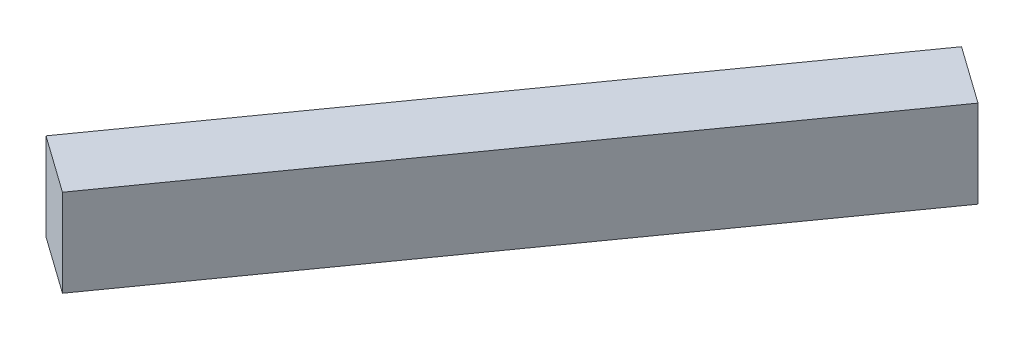
ISO-10303-21;
HEADER;
FILE_DESCRIPTION(('STEP AP214'),'2;1');
FILE_NAME('part.step','',(''),(''),'','','');
FILE_SCHEMA(('AUTOMOTIVE_DESIGN { 1 0 10303 214 1 1 1 1 }'));
ENDSEC;
DATA;
#1=APPLICATION_CONTEXT('core data for automotive mechanical design processes');
#2=APPLICATION_PROTOCOL_DEFINITION('international standard','automotive_design',2000,#1);
#3=PRODUCT_CONTEXT('',#1,'mechanical');
#4=PRODUCT('Part','Part','',(#3));
#5=PRODUCT_RELATED_PRODUCT_CATEGORY('part','',(#4));
#6=PRODUCT_DEFINITION_FORMATION('','',#4);
#7=PRODUCT_DEFINITION_CONTEXT('part definition',#1,'design');
#8=PRODUCT_DEFINITION('design','',#6,#7);
#9=PRODUCT_DEFINITION_SHAPE('','',#8);
#10=(LENGTH_UNIT() NAMED_UNIT(*) SI_UNIT(.MILLI.,.METRE.));
#11=(NAMED_UNIT(*) PLANE_ANGLE_UNIT() SI_UNIT($,.RADIAN.));
#12=(NAMED_UNIT(*) SI_UNIT($,.STERADIAN.) SOLID_ANGLE_UNIT());
#13=UNCERTAINTY_MEASURE_WITH_UNIT(LENGTH_MEASURE(1.E-05),#10,'distance_accuracy_value','');
#14=(GEOMETRIC_REPRESENTATION_CONTEXT(3) GLOBAL_UNCERTAINTY_ASSIGNED_CONTEXT((#13)) GLOBAL_UNIT_ASSIGNED_CONTEXT((#10,
#11,#12)) REPRESENTATION_CONTEXT('',''));
#15=CARTESIAN_POINT('',(0.,0.,0.));
#16=DIRECTION('',(0.,0.,1.));
#17=DIRECTION('',(1.,0.,0.));
#18=AXIS2_PLACEMENT_3D('',#15,#16,#17);
#19=CARTESIAN_POINT('',(-10.3499994101079,7.874,14.7234935886143));
#20=DIRECTION('',(-0.81483786328903,0.,-0.579688930850477));
#21=DIRECTION('',(-0.579688930850477,0.,0.81483786328903));
#22=AXIS2_PLACEMENT_3D('',#19,#20,#21);
#23=PLANE('',#22);
#24=DIRECTION('',(0.,1.,0.));
#25=VECTOR('',#24,1.);
#26=CARTESIAN_POINT('',(-10.3499994101079,7.874,14.7234935886143));
#27=LINE('',#26,#25);
#28=CARTESIAN_POINT('',(-10.3499994101079,7.62,14.7234935886143));
#29=VERTEX_POINT('',#28);
#30=CARTESIAN_POINT('',(-10.3499994101079,7.874,14.7234935886143));
#31=VERTEX_POINT('',#30);
#32=EDGE_CURVE('E20',#29,#31,#27,.T.);
#33=ORIENTED_EDGE('',*,*,#32,.T.);
#34=DIRECTION('',(-0.579688930850492,0.,0.814837863289019));
#35=VECTOR('',#34,1.);
#36=CARTESIAN_POINT('',(-10.3499994101079,7.874,14.7234935886143));
#37=LINE('',#36,#35);
#38=CARTESIAN_POINT('',(-11.4543068233781,7.874,16.2757597181799));
#39=VERTEX_POINT('',#38);
#40=EDGE_CURVE('E55',#31,#39,#37,.T.);
#41=ORIENTED_EDGE('',*,*,#40,.T.);
#42=DIRECTION('',(0.,1.,0.));
#43=VECTOR('',#42,1.);
#44=CARTESIAN_POINT('',(-11.4543068233781,7.874,16.2757597181799));
#45=LINE('',#44,#43);
#46=CARTESIAN_POINT('',(-11.4543068233781,7.62,16.2757597181799));
#47=VERTEX_POINT('',#46);
#48=EDGE_CURVE('E76',#39,#47,#45,.F.);
#49=ORIENTED_EDGE('',*,*,#48,.T.);
#50=DIRECTION('',(-0.579688930850492,0.,0.814837863289019));
#51=VECTOR('',#50,1.);
#52=CARTESIAN_POINT('',(-10.3499994101079,7.62,14.7234935886143));
#53=LINE('',#52,#51);
#54=EDGE_CURVE('E58',#29,#47,#53,.T.);
#55=ORIENTED_EDGE('',*,*,#54,.F.);
#56=EDGE_LOOP('',(#33,#41,#49,#55));
#57=FACE_BOUND('',#56,.T.);
#58=ADVANCED_FACE('F17',(#57),#23,.F.);
#59=CARTESIAN_POINT('',(-10.3499994101079,7.874,14.7234935886143));
#60=DIRECTION('',(-0.57968893085045,0.,0.814837863289049));
#61=DIRECTION('',(0.814837863289049,0.,0.57968893085045));
#62=AXIS2_PLACEMENT_3D('',#59,#60,#61);
#63=PLANE('',#62);
#64=DIRECTION('',(0.,1.,0.));
#65=VECTOR('',#64,1.);
#66=CARTESIAN_POINT('',(-10.5155744639282,7.874,14.6057007978655));
#67=LINE('',#66,#65);
#68=CARTESIAN_POINT('',(-10.5155744639282,7.62,14.6057007978655));
#69=VERTEX_POINT('',#68);
#70=CARTESIAN_POINT('',(-10.5155744639282,7.874,14.6057007978655));
#71=VERTEX_POINT('',#70);
#72=EDGE_CURVE('E73',#69,#71,#67,.T.);
#73=ORIENTED_EDGE('',*,*,#72,.T.);
#74=DIRECTION('',(0.814837863289015,0.,0.579688930850497));
#75=VECTOR('',#74,1.);
#76=CARTESIAN_POINT('',(-10.5155744639282,7.874,14.6057007978655));
#77=LINE('',#76,#75);
#78=EDGE_CURVE('E63',#71,#31,#77,.T.);
#79=ORIENTED_EDGE('',*,*,#78,.T.);
#80=ORIENTED_EDGE('',*,*,#32,.F.);
#81=DIRECTION('',(0.814837863289015,0.,0.579688930850497));
#82=VECTOR('',#81,1.);
#83=CARTESIAN_POINT('',(-10.5155744639282,7.62,14.6057007978655));
#84=LINE('',#83,#82);
#85=EDGE_CURVE('E80',#69,#29,#84,.T.);
#86=ORIENTED_EDGE('',*,*,#85,.F.);
#87=EDGE_LOOP('',(#73,#79,#80,#86));
#88=FACE_BOUND('',#87,.T.);
#89=ADVANCED_FACE('F72',(#88),#63,.F.);
#90=CARTESIAN_POINT('',(-10.3499994101079,7.874,14.7234935886143));
#91=DIRECTION('',(0.,-1.,0.));
#92=DIRECTION('',(0.,0.,-1.));
#93=AXIS2_PLACEMENT_3D('',#90,#91,#92);
#94=PLANE('',#93);
#95=ORIENTED_EDGE('',*,*,#78,.F.);
#96=DIRECTION('',(0.579688930850476,0.,-0.81483786328903));
#97=VECTOR('',#96,1.);
#98=CARTESIAN_POINT('',(-10.5155744639282,7.874,14.6057007978655));
#99=LINE('',#98,#97);
#100=CARTESIAN_POINT('',(-11.6198818773777,7.874,16.1579669276832));
#101=VERTEX_POINT('',#100);
#102=EDGE_CURVE('E83',#71,#101,#99,.F.);
#103=ORIENTED_EDGE('',*,*,#102,.T.);
#104=DIRECTION('',(-0.814837864171512,0.,-0.579688929610018));
#105=VECTOR('',#104,1.);
#106=CARTESIAN_POINT('',(-11.4543068233781,7.874,16.2757597181799));
#107=LINE('',#106,#105);
#108=EDGE_CURVE('E69',#101,#39,#107,.F.);
#109=ORIENTED_EDGE('',*,*,#108,.T.);
#110=ORIENTED_EDGE('',*,*,#40,.F.);
#111=EDGE_LOOP('',(#95,#103,#109,#110));
#112=FACE_BOUND('',#111,.T.);
#113=ADVANCED_FACE('F66',(#112),#94,.F.);
#114=CARTESIAN_POINT('',(-11.4543068233781,7.874,16.2757597181799));
#115=DIRECTION('',(0.579688929610018,0.,-0.814837864171512));
#116=DIRECTION('',(-0.814837864171512,0.,-0.579688929610018));
#117=AXIS2_PLACEMENT_3D('',#114,#115,#116);
#118=PLANE('',#117);
#119=ORIENTED_EDGE('',*,*,#48,.F.);
#120=ORIENTED_EDGE('',*,*,#108,.F.);
#121=DIRECTION('',(0.,1.,0.));
#122=VECTOR('',#121,1.);
#123=CARTESIAN_POINT('',(-11.6198818773777,7.874,16.1579669276832));
#124=LINE('',#123,#122);
#125=CARTESIAN_POINT('',(-11.6198818773777,7.62,16.1579669276832));
#126=VERTEX_POINT('',#125);
#127=EDGE_CURVE('E26',#101,#126,#124,.F.);
#128=ORIENTED_EDGE('',*,*,#127,.T.);
#129=DIRECTION('',(-0.814837864171561,0.,-0.57968892960995));
#130=VECTOR('',#129,1.);
#131=CARTESIAN_POINT('',(-11.4543068233781,7.62,16.2757597181799));
#132=LINE('',#131,#130);
#133=EDGE_CURVE('E34',#47,#126,#132,.T.);
#134=ORIENTED_EDGE('',*,*,#133,.F.);
#135=EDGE_LOOP('',(#119,#120,#128,#134));
#136=FACE_BOUND('',#135,.T.);
#137=ADVANCED_FACE('F88',(#136),#118,.F.);
#138=CARTESIAN_POINT('',(-10.3499994101079,7.62,14.7234935886143));
#139=DIRECTION('',(0.,-1.,0.));
#140=DIRECTION('',(0.,0.,-1.));
#141=AXIS2_PLACEMENT_3D('',#138,#139,#140);
#142=PLANE('',#141);
#143=DIRECTION('',(0.579688930850476,0.,-0.81483786328903));
#144=VECTOR('',#143,1.);
#145=CARTESIAN_POINT('',(-10.5155744639282,7.62,14.6057007978655));
#146=LINE('',#145,#144);
#147=EDGE_CURVE('E11',#126,#69,#146,.T.);
#148=ORIENTED_EDGE('',*,*,#147,.T.);
#149=ORIENTED_EDGE('',*,*,#85,.T.);
#150=ORIENTED_EDGE('',*,*,#54,.T.);
#151=ORIENTED_EDGE('',*,*,#133,.T.);
#152=EDGE_LOOP('',(#148,#149,#150,#151));
#153=FACE_BOUND('',#152,.T.);
#154=ADVANCED_FACE('F91',(#153),#142,.T.);
#155=CARTESIAN_POINT('',(-10.5155744639282,7.874,14.6057007978655));
#156=DIRECTION('',(0.81483786328903,0.,0.579688930850476));
#157=DIRECTION('',(0.579688930850476,0.,-0.81483786328903));
#158=AXIS2_PLACEMENT_3D('',#155,#156,#157);
#159=PLANE('',#158);
#160=ORIENTED_EDGE('',*,*,#127,.F.);
#161=ORIENTED_EDGE('',*,*,#102,.F.);
#162=ORIENTED_EDGE('',*,*,#72,.F.);
#163=ORIENTED_EDGE('',*,*,#147,.F.);
#164=EDGE_LOOP('',(#160,#161,#162,#163));
#165=FACE_BOUND('',#164,.T.);
#166=ADVANCED_FACE('F90',(#165),#159,.F.);
#167=CLOSED_SHELL('',(#58,#89,#113,#137,#154,#166));
#168=MANIFOLD_SOLID_BREP('B1',#167);
#169=ADVANCED_BREP_SHAPE_REPRESENTATION('',(#18,#168),#14);
#170=SHAPE_DEFINITION_REPRESENTATION(#9,#169);
ENDSEC;
END-ISO-10303-21;
